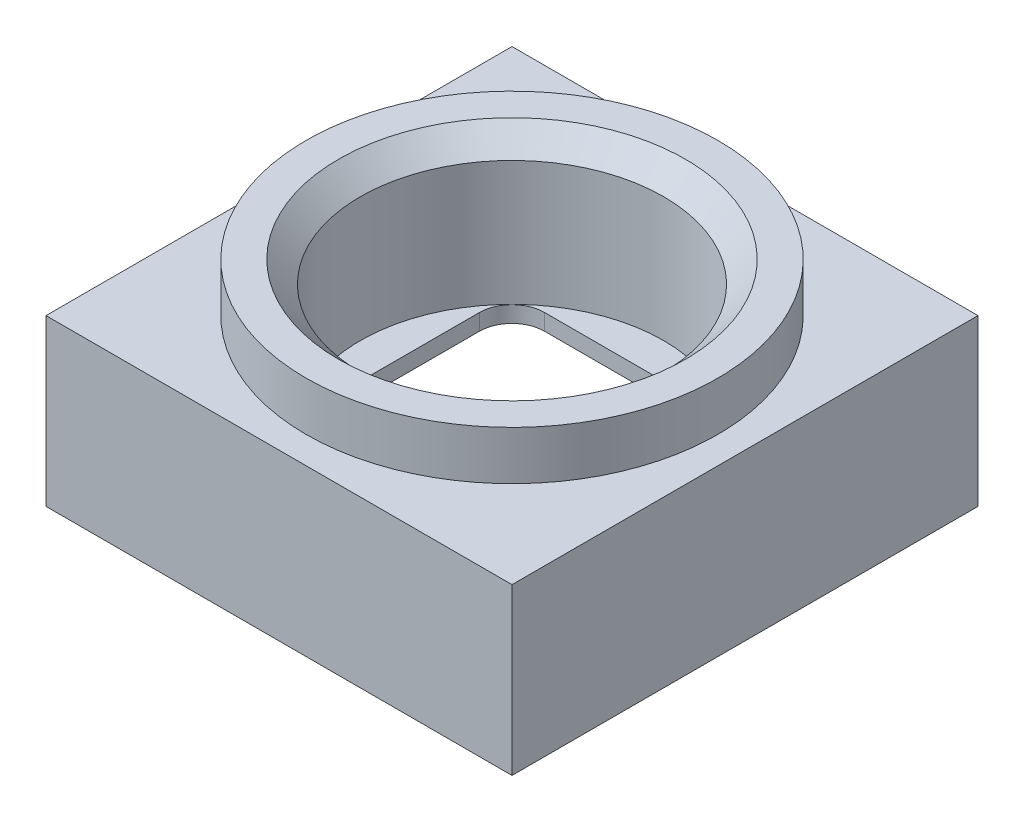
ISO-10303-21;
HEADER;
FILE_DESCRIPTION(('STEP AP214'),'2;1');
FILE_NAME('part.step','',(''),(''),'','','');
FILE_SCHEMA(('AUTOMOTIVE_DESIGN { 1 0 10303 214 1 1 1 1 }'));
ENDSEC;
DATA;
#1=APPLICATION_CONTEXT('core data for automotive mechanical design processes');
#2=APPLICATION_PROTOCOL_DEFINITION('international standard','automotive_design',2000,#1);
#3=PRODUCT_CONTEXT('',#1,'mechanical');
#4=PRODUCT('Part','Part','',(#3));
#5=PRODUCT_RELATED_PRODUCT_CATEGORY('part','',(#4));
#6=PRODUCT_DEFINITION_FORMATION('','',#4);
#7=PRODUCT_DEFINITION_CONTEXT('part definition',#1,'design');
#8=PRODUCT_DEFINITION('design','',#6,#7);
#9=PRODUCT_DEFINITION_SHAPE('','',#8);
#10=(LENGTH_UNIT() NAMED_UNIT(*) SI_UNIT(.MILLI.,.METRE.));
#11=(NAMED_UNIT(*) PLANE_ANGLE_UNIT() SI_UNIT($,.RADIAN.));
#12=(NAMED_UNIT(*) SI_UNIT($,.STERADIAN.) SOLID_ANGLE_UNIT());
#13=UNCERTAINTY_MEASURE_WITH_UNIT(LENGTH_MEASURE(1.E-05),#10,'distance_accuracy_value','');
#14=(GEOMETRIC_REPRESENTATION_CONTEXT(3) GLOBAL_UNCERTAINTY_ASSIGNED_CONTEXT((#13)) GLOBAL_UNIT_ASSIGNED_CONTEXT((#10,
#11,#12)) REPRESENTATION_CONTEXT('',''));
#15=CARTESIAN_POINT('',(0.,0.,0.));
#16=DIRECTION('',(0.,0.,1.));
#17=DIRECTION('',(1.,0.,0.));
#18=AXIS2_PLACEMENT_3D('',#15,#16,#17);
#19=CARTESIAN_POINT('',(0.,3.05,0.));
#20=DIRECTION('',(0.,1.,0.));
#21=DIRECTION('',(0.,0.,1.));
#22=AXIS2_PLACEMENT_3D('',#19,#20,#21);
#23=PLANE('',#22);
#24=DIRECTION('',(1.,0.,0.));
#25=VECTOR('',#24,1.);
#26=CARTESIAN_POINT('',(-4.3,3.05,4.3));
#27=LINE('',#26,#25);
#28=CARTESIAN_POINT('',(-4.3,3.05,4.3));
#29=VERTEX_POINT('',#28);
#30=CARTESIAN_POINT('',(4.3,3.05,4.3));
#31=VERTEX_POINT('',#30);
#32=EDGE_CURVE('E206',#29,#31,#27,.T.);
#33=ORIENTED_EDGE('',*,*,#32,.T.);
#34=DIRECTION('',(0.,0.,-1.));
#35=VECTOR('',#34,1.);
#36=CARTESIAN_POINT('',(4.3,3.05,4.3));
#37=LINE('',#36,#35);
#38=CARTESIAN_POINT('',(4.3,3.05,-4.3));
#39=VERTEX_POINT('',#38);
#40=EDGE_CURVE('E214',#31,#39,#37,.T.);
#41=ORIENTED_EDGE('',*,*,#40,.T.);
#42=DIRECTION('',(-1.,0.,0.));
#43=VECTOR('',#42,1.);
#44=CARTESIAN_POINT('',(4.3,3.05,-4.3));
#45=LINE('',#44,#43);
#46=CARTESIAN_POINT('',(-4.3,3.05,-4.3));
#47=VERTEX_POINT('',#46);
#48=EDGE_CURVE('E219',#39,#47,#45,.T.);
#49=ORIENTED_EDGE('',*,*,#48,.T.);
#50=DIRECTION('',(0.,0.,1.));
#51=VECTOR('',#50,1.);
#52=CARTESIAN_POINT('',(-4.3,3.05,-4.3));
#53=LINE('',#52,#51);
#54=EDGE_CURVE('E224',#47,#29,#53,.T.);
#55=ORIENTED_EDGE('',*,*,#54,.T.);
#56=EDGE_LOOP('',(#33,#41,#49,#55));
#57=FACE_BOUND('',#56,.T.);
#58=CARTESIAN_POINT('',(0.,3.05,0.));
#59=DIRECTION('',(0.,1.,0.));
#60=DIRECTION('',(0.,0.,1.));
#61=AXIS2_PLACEMENT_3D('',#58,#59,#60);
#62=CIRCLE('',#61,3.8);
#63=CARTESIAN_POINT('',(0.,3.05,3.8));
#64=VERTEX_POINT('',#63);
#65=EDGE_CURVE('E228',#64,#64,#62,.T.);
#66=ORIENTED_EDGE('',*,*,#65,.F.);
#67=EDGE_LOOP('',(#66));
#68=FACE_BOUND('',#67,.T.);
#69=ADVANCED_FACE('F37',(#57,#68),#23,.T.);
#70=CARTESIAN_POINT('',(0.,1.25,0.));
#71=DIRECTION('',(0.,1.,0.));
#72=DIRECTION('',(0.,0.,1.));
#73=AXIS2_PLACEMENT_3D('',#70,#71,#72);
#74=PLANE('',#73);
#75=DIRECTION('',(1.,0.,0.));
#76=VECTOR('',#75,1.);
#77=CARTESIAN_POINT('',(-1.55,1.25,2.15));
#78=LINE('',#77,#76);
#79=CARTESIAN_POINT('',(-1.55,1.25,2.15));
#80=VERTEX_POINT('',#79);
#81=CARTESIAN_POINT('',(1.55,1.25,2.15));
#82=VERTEX_POINT('',#81);
#83=EDGE_CURVE('E237',#80,#82,#78,.T.);
#84=ORIENTED_EDGE('',*,*,#83,.F.);
#85=CARTESIAN_POINT('',(-1.55,1.25,1.55));
#86=DIRECTION('',(0.,1.,0.));
#87=DIRECTION('',(0.,0.,1.));
#88=AXIS2_PLACEMENT_3D('',#85,#86,#87);
#89=CIRCLE('',#88,0.6);
#90=CARTESIAN_POINT('',(-2.15,1.25,1.55));
#91=VERTEX_POINT('',#90);
#92=EDGE_CURVE('E235',#91,#80,#89,.T.);
#93=ORIENTED_EDGE('',*,*,#92,.F.);
#94=DIRECTION('',(0.,0.,1.));
#95=VECTOR('',#94,1.);
#96=CARTESIAN_POINT('',(-2.15,1.25,-1.55));
#97=LINE('',#96,#95);
#98=CARTESIAN_POINT('',(-2.15,1.25,-1.55));
#99=VERTEX_POINT('',#98);
#100=EDGE_CURVE('E251',#99,#91,#97,.T.);
#101=ORIENTED_EDGE('',*,*,#100,.F.);
#102=CARTESIAN_POINT('',(-1.55,1.25,-1.55));
#103=DIRECTION('',(0.,1.,0.));
#104=DIRECTION('',(0.,0.,1.));
#105=AXIS2_PLACEMENT_3D('',#102,#103,#104);
#106=CIRCLE('',#105,0.6);
#107=CARTESIAN_POINT('',(-1.55,1.25,-2.15));
#108=VERTEX_POINT('',#107);
#109=EDGE_CURVE('E248',#108,#99,#106,.T.);
#110=ORIENTED_EDGE('',*,*,#109,.F.);
#111=DIRECTION('',(-1.,0.,0.));
#112=VECTOR('',#111,1.);
#113=CARTESIAN_POINT('',(-1.55,1.25,-2.15));
#114=LINE('',#113,#112);
#115=CARTESIAN_POINT('',(1.55,1.25,-2.15));
#116=VERTEX_POINT('',#115);
#117=EDGE_CURVE('E246',#116,#108,#114,.T.);
#118=ORIENTED_EDGE('',*,*,#117,.F.);
#119=CARTESIAN_POINT('',(1.55,1.25,-1.55));
#120=DIRECTION('',(0.,1.,0.));
#121=DIRECTION('',(0.,0.,-1.));
#122=AXIS2_PLACEMENT_3D('',#119,#120,#121);
#123=CIRCLE('',#122,0.6);
#124=CARTESIAN_POINT('',(2.15,1.25,-1.55));
#125=VERTEX_POINT('',#124);
#126=EDGE_CURVE('E244',#125,#116,#123,.T.);
#127=ORIENTED_EDGE('',*,*,#126,.F.);
#128=DIRECTION('',(0.,0.,-1.));
#129=VECTOR('',#128,1.);
#130=CARTESIAN_POINT('',(2.15,1.25,-1.55));
#131=LINE('',#130,#129);
#132=CARTESIAN_POINT('',(2.15,1.25,1.55));
#133=VERTEX_POINT('',#132);
#134=EDGE_CURVE('E242',#133,#125,#131,.T.);
#135=ORIENTED_EDGE('',*,*,#134,.F.);
#136=CARTESIAN_POINT('',(1.55,1.25,1.55));
#137=DIRECTION('',(0.,1.,0.));
#138=DIRECTION('',(0.,0.,1.));
#139=AXIS2_PLACEMENT_3D('',#136,#137,#138);
#140=CIRCLE('',#139,0.600000000000001);
#141=EDGE_CURVE('E240',#82,#133,#140,.T.);
#142=ORIENTED_EDGE('',*,*,#141,.F.);
#143=EDGE_LOOP('',(#84,#93,#101,#110,#118,#127,#135,#142));
#144=FACE_BOUND('',#143,.T.);
#145=CARTESIAN_POINT('',(0.,1.25,0.));
#146=DIRECTION('',(0.,1.,0.));
#147=DIRECTION('',(0.,0.,1.));
#148=AXIS2_PLACEMENT_3D('',#145,#146,#147);
#149=CIRCLE('',#148,2.8);
#150=CARTESIAN_POINT('',(0.,1.25,2.8));
#151=VERTEX_POINT('',#150);
#152=EDGE_CURVE('E400',#151,#151,#149,.F.);
#153=ORIENTED_EDGE('',*,*,#152,.F.);
#154=EDGE_LOOP('',(#153));
#155=FACE_BOUND('',#154,.T.);
#156=ADVANCED_FACE('F419',(#144,#155),#74,.T.);
#157=CARTESIAN_POINT('',(0.,0.,0.));
#158=DIRECTION('',(0.,1.,0.));
#159=DIRECTION('',(0.,0.,1.));
#160=AXIS2_PLACEMENT_3D('',#157,#158,#159);
#161=PLANE('',#160);
#162=DIRECTION('',(0.,0.,1.));
#163=VECTOR('',#162,1.);
#164=CARTESIAN_POINT('',(-4.3,0.,-4.3));
#165=LINE('',#164,#163);
#166=CARTESIAN_POINT('',(-4.3,0.,-4.3));
#167=VERTEX_POINT('',#166);
#168=CARTESIAN_POINT('',(-4.3,0.,4.3));
#169=VERTEX_POINT('',#168);
#170=EDGE_CURVE('E389',#167,#169,#165,.T.);
#171=ORIENTED_EDGE('',*,*,#170,.F.);
#172=DIRECTION('',(-1.,0.,0.));
#173=VECTOR('',#172,1.);
#174=CARTESIAN_POINT('',(-4.3,0.,-4.3));
#175=LINE('',#174,#173);
#176=CARTESIAN_POINT('',(4.3,0.,-4.3));
#177=VERTEX_POINT('',#176);
#178=EDGE_CURVE('E60',#177,#167,#175,.T.);
#179=ORIENTED_EDGE('',*,*,#178,.F.);
#180=DIRECTION('',(0.,0.,-1.));
#181=VECTOR('',#180,1.);
#182=CARTESIAN_POINT('',(4.3,0.,-4.3));
#183=LINE('',#182,#181);
#184=CARTESIAN_POINT('',(4.3,0.,4.3));
#185=VERTEX_POINT('',#184);
#186=EDGE_CURVE('E393',#185,#177,#183,.T.);
#187=ORIENTED_EDGE('',*,*,#186,.F.);
#188=DIRECTION('',(1.,0.,0.));
#189=VECTOR('',#188,1.);
#190=CARTESIAN_POINT('',(-4.3,0.,4.3));
#191=LINE('',#190,#189);
#192=EDGE_CURVE('E207',#169,#185,#191,.T.);
#193=ORIENTED_EDGE('',*,*,#192,.F.);
#194=EDGE_LOOP('',(#171,#179,#187,#193));
#195=FACE_BOUND('',#194,.T.);
#196=DIRECTION('',(0.,0.,1.));
#197=VECTOR('',#196,1.);
#198=CARTESIAN_POINT('',(-4.,0.,-4.));
#199=LINE('',#198,#197);
#200=CARTESIAN_POINT('',(-4.,0.,-4.));
#201=VERTEX_POINT('',#200);
#202=CARTESIAN_POINT('',(-4.,0.,4.));
#203=VERTEX_POINT('',#202);
#204=EDGE_CURVE('E52',#201,#203,#199,.T.);
#205=ORIENTED_EDGE('',*,*,#204,.T.);
#206=DIRECTION('',(1.,0.,0.));
#207=VECTOR('',#206,1.);
#208=CARTESIAN_POINT('',(-4.,0.,4.));
#209=LINE('',#208,#207);
#210=CARTESIAN_POINT('',(4.,0.,4.));
#211=VERTEX_POINT('',#210);
#212=EDGE_CURVE('E374',#203,#211,#209,.T.);
#213=ORIENTED_EDGE('',*,*,#212,.T.);
#214=DIRECTION('',(0.,0.,-1.));
#215=VECTOR('',#214,1.);
#216=CARTESIAN_POINT('',(4.,0.,-4.));
#217=LINE('',#216,#215);
#218=CARTESIAN_POINT('',(4.,0.,-4.));
#219=VERTEX_POINT('',#218);
#220=EDGE_CURVE('E377',#211,#219,#217,.T.);
#221=ORIENTED_EDGE('',*,*,#220,.T.);
#222=DIRECTION('',(-1.,0.,0.));
#223=VECTOR('',#222,1.);
#224=CARTESIAN_POINT('',(-4.,0.,-4.));
#225=LINE('',#224,#223);
#226=EDGE_CURVE('E363',#219,#201,#225,.T.);
#227=ORIENTED_EDGE('',*,*,#226,.T.);
#228=EDGE_LOOP('',(#205,#213,#221,#227));
#229=FACE_BOUND('',#228,.T.);
#230=ADVANCED_FACE('F424',(#195,#229),#161,.F.);
#231=CARTESIAN_POINT('',(-4.3,0.6,-4.3));
#232=DIRECTION('',(1.,0.,0.));
#233=DIRECTION('',(0.,0.,-1.));
#234=AXIS2_PLACEMENT_3D('',#231,#232,#233);
#235=PLANE('',#234);
#236=ORIENTED_EDGE('',*,*,#170,.T.);
#237=DIRECTION('',(0.,-1.,0.));
#238=VECTOR('',#237,1.);
#239=CARTESIAN_POINT('',(-4.3,0.6,4.3));
#240=LINE('',#239,#238);
#241=EDGE_CURVE('E210',#29,#169,#240,.T.);
#242=ORIENTED_EDGE('',*,*,#241,.F.);
#243=ORIENTED_EDGE('',*,*,#54,.F.);
#244=DIRECTION('',(0.,-1.,0.));
#245=VECTOR('',#244,1.);
#246=CARTESIAN_POINT('',(-4.3,0.6,-4.3));
#247=LINE('',#246,#245);
#248=EDGE_CURVE('E396',#47,#167,#247,.T.);
#249=ORIENTED_EDGE('',*,*,#248,.T.);
#250=EDGE_LOOP('',(#236,#242,#243,#249));
#251=FACE_BOUND('',#250,.T.);
#252=ADVANCED_FACE('F519',(#251),#235,.F.);
#253=CARTESIAN_POINT('',(-4.3,0.6,4.3));
#254=DIRECTION('',(0.,0.,-1.));
#255=DIRECTION('',(-1.,0.,0.));
#256=AXIS2_PLACEMENT_3D('',#253,#254,#255);
#257=PLANE('',#256);
#258=ORIENTED_EDGE('',*,*,#192,.T.);
#259=DIRECTION('',(0.,-1.,0.));
#260=VECTOR('',#259,1.);
#261=CARTESIAN_POINT('',(4.3,0.6,4.3));
#262=LINE('',#261,#260);
#263=EDGE_CURVE('E201',#31,#185,#262,.T.);
#264=ORIENTED_EDGE('',*,*,#263,.F.);
#265=ORIENTED_EDGE('',*,*,#32,.F.);
#266=ORIENTED_EDGE('',*,*,#241,.T.);
#267=EDGE_LOOP('',(#258,#264,#265,#266));
#268=FACE_BOUND('',#267,.T.);
#269=ADVANCED_FACE('F203',(#268),#257,.F.);
#270=CARTESIAN_POINT('',(4.3,0.6,-4.3));
#271=DIRECTION('',(-1.,0.,0.));
#272=DIRECTION('',(0.,0.,1.));
#273=AXIS2_PLACEMENT_3D('',#270,#271,#272);
#274=PLANE('',#273);
#275=ORIENTED_EDGE('',*,*,#186,.T.);
#276=DIRECTION('',(0.,-1.,0.));
#277=VECTOR('',#276,1.);
#278=CARTESIAN_POINT('',(4.3,0.6,-4.3));
#279=LINE('',#278,#277);
#280=EDGE_CURVE('E211',#39,#177,#279,.T.);
#281=ORIENTED_EDGE('',*,*,#280,.F.);
#282=ORIENTED_EDGE('',*,*,#40,.F.);
#283=ORIENTED_EDGE('',*,*,#263,.T.);
#284=EDGE_LOOP('',(#275,#281,#282,#283));
#285=FACE_BOUND('',#284,.T.);
#286=ADVANCED_FACE('F215',(#285),#274,.F.);
#287=CARTESIAN_POINT('',(-4.3,0.6,-4.3));
#288=DIRECTION('',(0.,0.,1.));
#289=DIRECTION('',(1.,0.,0.));
#290=AXIS2_PLACEMENT_3D('',#287,#288,#289);
#291=PLANE('',#290);
#292=ORIENTED_EDGE('',*,*,#178,.T.);
#293=ORIENTED_EDGE('',*,*,#248,.F.);
#294=ORIENTED_EDGE('',*,*,#48,.F.);
#295=ORIENTED_EDGE('',*,*,#280,.T.);
#296=EDGE_LOOP('',(#292,#293,#294,#295));
#297=FACE_BOUND('',#296,.T.);
#298=ADVANCED_FACE('F516',(#297),#291,.F.);
#299=CARTESIAN_POINT('',(-4.,0.6,-4.));
#300=DIRECTION('',(1.,0.,0.));
#301=DIRECTION('',(0.,0.,-1.));
#302=AXIS2_PLACEMENT_3D('',#299,#300,#301);
#303=PLANE('',#302);
#304=ORIENTED_EDGE('',*,*,#204,.F.);
#305=DIRECTION('',(0.,-1.,0.));
#306=VECTOR('',#305,1.);
#307=CARTESIAN_POINT('',(-4.,0.6,-4.));
#308=LINE('',#307,#306);
#309=CARTESIAN_POINT('',(-4.,0.6,-4.));
#310=VERTEX_POINT('',#309);
#311=EDGE_CURVE('E372',#310,#201,#308,.T.);
#312=ORIENTED_EDGE('',*,*,#311,.F.);
#313=DIRECTION('',(0.,0.,1.));
#314=VECTOR('',#313,1.);
#315=CARTESIAN_POINT('',(-4.,0.6,-4.));
#316=LINE('',#315,#314);
#317=CARTESIAN_POINT('',(-4.,0.6,4.));
#318=VERTEX_POINT('',#317);
#319=EDGE_CURVE('E359',#310,#318,#316,.T.);
#320=ORIENTED_EDGE('',*,*,#319,.T.);
#321=DIRECTION('',(0.,-1.,0.));
#322=VECTOR('',#321,1.);
#323=CARTESIAN_POINT('',(-4.,0.6,4.));
#324=LINE('',#323,#322);
#325=EDGE_CURVE('E387',#318,#203,#324,.T.);
#326=ORIENTED_EDGE('',*,*,#325,.T.);
#327=EDGE_LOOP('',(#304,#312,#320,#326));
#328=FACE_BOUND('',#327,.T.);
#329=ADVANCED_FACE('F512',(#328),#303,.T.);
#330=CARTESIAN_POINT('',(-4.,0.6,4.));
#331=DIRECTION('',(0.,0.,-1.));
#332=DIRECTION('',(-1.,0.,0.));
#333=AXIS2_PLACEMENT_3D('',#330,#331,#332);
#334=PLANE('',#333);
#335=ORIENTED_EDGE('',*,*,#212,.F.);
#336=ORIENTED_EDGE('',*,*,#325,.F.);
#337=DIRECTION('',(1.,0.,0.));
#338=VECTOR('',#337,1.);
#339=CARTESIAN_POINT('',(-4.,0.6,4.));
#340=LINE('',#339,#338);
#341=CARTESIAN_POINT('',(4.,0.6,4.));
#342=VERTEX_POINT('',#341);
#343=EDGE_CURVE('E362',#318,#342,#340,.T.);
#344=ORIENTED_EDGE('',*,*,#343,.T.);
#345=DIRECTION('',(0.,-1.,0.));
#346=VECTOR('',#345,1.);
#347=CARTESIAN_POINT('',(4.,0.6,4.));
#348=LINE('',#347,#346);
#349=EDGE_CURVE('E385',#342,#211,#348,.T.);
#350=ORIENTED_EDGE('',*,*,#349,.T.);
#351=EDGE_LOOP('',(#335,#336,#344,#350));
#352=FACE_BOUND('',#351,.T.);
#353=ADVANCED_FACE('F508',(#352),#334,.T.);
#354=CARTESIAN_POINT('',(4.,0.6,-4.));
#355=DIRECTION('',(-1.,0.,0.));
#356=DIRECTION('',(0.,0.,1.));
#357=AXIS2_PLACEMENT_3D('',#354,#355,#356);
#358=PLANE('',#357);
#359=ORIENTED_EDGE('',*,*,#220,.F.);
#360=ORIENTED_EDGE('',*,*,#349,.F.);
#361=DIRECTION('',(0.,0.,-1.));
#362=VECTOR('',#361,1.);
#363=CARTESIAN_POINT('',(4.,0.6,-4.));
#364=LINE('',#363,#362);
#365=CARTESIAN_POINT('',(4.,0.6,-4.));
#366=VERTEX_POINT('',#365);
#367=EDGE_CURVE('E366',#342,#366,#364,.T.);
#368=ORIENTED_EDGE('',*,*,#367,.T.);
#369=DIRECTION('',(0.,-1.,0.));
#370=VECTOR('',#369,1.);
#371=CARTESIAN_POINT('',(4.,0.6,-4.));
#372=LINE('',#371,#370);
#373=EDGE_CURVE('E383',#366,#219,#372,.T.);
#374=ORIENTED_EDGE('',*,*,#373,.T.);
#375=EDGE_LOOP('',(#359,#360,#368,#374));
#376=FACE_BOUND('',#375,.T.);
#377=ADVANCED_FACE('F504',(#376),#358,.T.);
#378=CARTESIAN_POINT('',(-4.,0.6,-4.));
#379=DIRECTION('',(0.,0.,1.));
#380=DIRECTION('',(1.,0.,0.));
#381=AXIS2_PLACEMENT_3D('',#378,#379,#380);
#382=PLANE('',#381);
#383=ORIENTED_EDGE('',*,*,#226,.F.);
#384=ORIENTED_EDGE('',*,*,#373,.F.);
#385=DIRECTION('',(-1.,0.,0.));
#386=VECTOR('',#385,1.);
#387=CARTESIAN_POINT('',(-4.,0.6,-4.));
#388=LINE('',#387,#386);
#389=EDGE_CURVE('E369',#366,#310,#388,.T.);
#390=ORIENTED_EDGE('',*,*,#389,.T.);
#391=ORIENTED_EDGE('',*,*,#311,.T.);
#392=EDGE_LOOP('',(#383,#384,#390,#391));
#393=FACE_BOUND('',#392,.T.);
#394=ADVANCED_FACE('F500',(#393),#382,.T.);
#395=CARTESIAN_POINT('',(0.,0.6,0.));
#396=DIRECTION('',(0.,1.,0.));
#397=DIRECTION('',(0.,0.,1.));
#398=AXIS2_PLACEMENT_3D('',#395,#396,#397);
#399=PLANE('',#398);
#400=ORIENTED_EDGE('',*,*,#319,.F.);
#401=ORIENTED_EDGE('',*,*,#389,.F.);
#402=ORIENTED_EDGE('',*,*,#367,.F.);
#403=ORIENTED_EDGE('',*,*,#343,.F.);
#404=EDGE_LOOP('',(#400,#401,#402,#403));
#405=FACE_BOUND('',#404,.T.);
#406=CARTESIAN_POINT('',(3.1,0.6,-3.1));
#407=DIRECTION('',(0.,1.,0.));
#408=DIRECTION('',(0.,0.,1.));
#409=AXIS2_PLACEMENT_3D('',#406,#407,#408);
#410=CIRCLE('',#409,0.35);
#411=CARTESIAN_POINT('',(3.2,0.6,-2.76458980337503));
#412=VERTEX_POINT('',#411);
#413=CARTESIAN_POINT('',(2.76458980337503,0.6,-3.2));
#414=VERTEX_POINT('',#413);
#415=EDGE_CURVE('E293',#412,#414,#410,.T.);
#416=ORIENTED_EDGE('',*,*,#415,.T.);
#417=DIRECTION('',(-1.,0.,0.));
#418=VECTOR('',#417,1.);
#419=CARTESIAN_POINT('',(-2.76458980337503,0.6,-3.2));
#420=LINE('',#419,#418);
#421=CARTESIAN_POINT('',(-2.76458980337503,0.6,-3.2));
#422=VERTEX_POINT('',#421);
#423=EDGE_CURVE('E322',#414,#422,#420,.T.);
#424=ORIENTED_EDGE('',*,*,#423,.T.);
#425=CARTESIAN_POINT('',(-3.1,0.6,-3.1));
#426=DIRECTION('',(0.,1.,0.));
#427=DIRECTION('',(0.,0.,-1.));
#428=AXIS2_PLACEMENT_3D('',#425,#426,#427);
#429=CIRCLE('',#428,0.35);
#430=CARTESIAN_POINT('',(-3.2,0.6,-2.76458980337503));
#431=VERTEX_POINT('',#430);
#432=EDGE_CURVE('E325',#422,#431,#429,.T.);
#433=ORIENTED_EDGE('',*,*,#432,.T.);
#434=DIRECTION('',(0.,0.,1.));
#435=VECTOR('',#434,1.);
#436=CARTESIAN_POINT('',(-3.2,0.6,-2.76458980337503));
#437=LINE('',#436,#435);
#438=CARTESIAN_POINT('',(-3.2,0.6,2.76458980337503));
#439=VERTEX_POINT('',#438);
#440=EDGE_CURVE('E328',#431,#439,#437,.T.);
#441=ORIENTED_EDGE('',*,*,#440,.T.);
#442=CARTESIAN_POINT('',(-3.1,0.6,3.1));
#443=DIRECTION('',(0.,1.,0.));
#444=DIRECTION('',(0.,0.,1.));
#445=AXIS2_PLACEMENT_3D('',#442,#443,#444);
#446=CIRCLE('',#445,0.35);
#447=CARTESIAN_POINT('',(-2.76458980337503,0.6,3.2));
#448=VERTEX_POINT('',#447);
#449=EDGE_CURVE('E331',#439,#448,#446,.T.);
#450=ORIENTED_EDGE('',*,*,#449,.T.);
#451=DIRECTION('',(1.,0.,0.));
#452=VECTOR('',#451,1.);
#453=CARTESIAN_POINT('',(-2.76458980337503,0.6,3.2));
#454=LINE('',#453,#452);
#455=CARTESIAN_POINT('',(2.76458980337503,0.6,3.2));
#456=VERTEX_POINT('',#455);
#457=EDGE_CURVE('E334',#448,#456,#454,.T.);
#458=ORIENTED_EDGE('',*,*,#457,.T.);
#459=CARTESIAN_POINT('',(3.1,0.6,3.1));
#460=DIRECTION('',(0.,1.,0.));
#461=DIRECTION('',(0.,0.,-1.));
#462=AXIS2_PLACEMENT_3D('',#459,#460,#461);
#463=CIRCLE('',#462,0.35);
#464=CARTESIAN_POINT('',(3.2,0.6,2.76458980337503));
#465=VERTEX_POINT('',#464);
#466=EDGE_CURVE('E337',#456,#465,#463,.T.);
#467=ORIENTED_EDGE('',*,*,#466,.T.);
#468=DIRECTION('',(0.,0.,-1.));
#469=VECTOR('',#468,1.);
#470=CARTESIAN_POINT('',(3.2,0.6,-2.76458980337503));
#471=LINE('',#470,#469);
#472=EDGE_CURVE('E298',#465,#412,#471,.T.);
#473=ORIENTED_EDGE('',*,*,#472,.T.);
#474=EDGE_LOOP('',(#416,#424,#433,#441,#450,#458,#467,#473));
#475=FACE_BOUND('',#474,.T.);
#476=ADVANCED_FACE('F496',(#405,#475),#399,.F.);
#477=CARTESIAN_POINT('',(3.1,0.95,-3.1));
#478=DIRECTION('',(0.,-1.,0.));
#479=DIRECTION('',(0.,0.,-1.));
#480=AXIS2_PLACEMENT_3D('',#477,#478,#479);
#481=CYLINDRICAL_SURFACE('',#480,0.35);
#482=ORIENTED_EDGE('',*,*,#415,.F.);
#483=DIRECTION('',(0.,-1.,0.));
#484=VECTOR('',#483,1.);
#485=CARTESIAN_POINT('',(3.2,0.95,-2.76458980337503));
#486=LINE('',#485,#484);
#487=CARTESIAN_POINT('',(3.2,0.95,-2.76458980337503));
#488=VERTEX_POINT('',#487);
#489=EDGE_CURVE('E319',#488,#412,#486,.T.);
#490=ORIENTED_EDGE('',*,*,#489,.F.);
#491=CARTESIAN_POINT('',(3.1,0.95,-3.1));
#492=DIRECTION('',(0.,1.,0.));
#493=DIRECTION('',(0.,0.,1.));
#494=AXIS2_PLACEMENT_3D('',#491,#492,#493);
#495=CIRCLE('',#494,0.35);
#496=CARTESIAN_POINT('',(2.76458980337503,0.95,-3.2));
#497=VERTEX_POINT('',#496);
#498=EDGE_CURVE('E294',#488,#497,#495,.T.);
#499=ORIENTED_EDGE('',*,*,#498,.T.);
#500=DIRECTION('',(0.,-1.,0.));
#501=VECTOR('',#500,1.);
#502=CARTESIAN_POINT('',(2.76458980337503,0.95,-3.2));
#503=LINE('',#502,#501);
#504=EDGE_CURVE('E356',#497,#414,#503,.T.);
#505=ORIENTED_EDGE('',*,*,#504,.T.);
#506=EDGE_LOOP('',(#482,#490,#499,#505));
#507=FACE_BOUND('',#506,.T.);
#508=ADVANCED_FACE('F492',(#507),#481,.F.);
#509=CARTESIAN_POINT('',(-2.76458980337503,0.95,-3.2));
#510=DIRECTION('',(0.,0.,1.));
#511=DIRECTION('',(1.,0.,0.));
#512=AXIS2_PLACEMENT_3D('',#509,#510,#511);
#513=PLANE('',#512);
#514=ORIENTED_EDGE('',*,*,#423,.F.);
#515=ORIENTED_EDGE('',*,*,#504,.F.);
#516=DIRECTION('',(-1.,0.,0.));
#517=VECTOR('',#516,1.);
#518=CARTESIAN_POINT('',(-2.76458980337503,0.95,-3.2));
#519=LINE('',#518,#517);
#520=CARTESIAN_POINT('',(-2.76458980337503,0.95,-3.2));
#521=VERTEX_POINT('',#520);
#522=EDGE_CURVE('E297',#497,#521,#519,.T.);
#523=ORIENTED_EDGE('',*,*,#522,.T.);
#524=DIRECTION('',(0.,-1.,0.));
#525=VECTOR('',#524,1.);
#526=CARTESIAN_POINT('',(-2.76458980337503,0.95,-3.2));
#527=LINE('',#526,#525);
#528=EDGE_CURVE('E354',#521,#422,#527,.T.);
#529=ORIENTED_EDGE('',*,*,#528,.T.);
#530=EDGE_LOOP('',(#514,#515,#523,#529));
#531=FACE_BOUND('',#530,.T.);
#532=ADVANCED_FACE('F488',(#531),#513,.T.);
#533=CARTESIAN_POINT('',(-3.1,0.95,-3.1));
#534=DIRECTION('',(0.,-1.,0.));
#535=DIRECTION('',(0.,0.,-1.));
#536=AXIS2_PLACEMENT_3D('',#533,#534,#535);
#537=CYLINDRICAL_SURFACE('',#536,0.35);
#538=ORIENTED_EDGE('',*,*,#432,.F.);
#539=ORIENTED_EDGE('',*,*,#528,.F.);
#540=CARTESIAN_POINT('',(-3.1,0.95,-3.1));
#541=DIRECTION('',(0.,1.,0.));
#542=DIRECTION('',(0.,0.,-1.));
#543=AXIS2_PLACEMENT_3D('',#540,#541,#542);
#544=CIRCLE('',#543,0.35);
#545=CARTESIAN_POINT('',(-3.2,0.95,-2.76458980337503));
#546=VERTEX_POINT('',#545);
#547=EDGE_CURVE('E301',#521,#546,#544,.T.);
#548=ORIENTED_EDGE('',*,*,#547,.T.);
#549=DIRECTION('',(0.,-1.,0.));
#550=VECTOR('',#549,1.);
#551=CARTESIAN_POINT('',(-3.2,0.95,-2.76458980337503));
#552=LINE('',#551,#550);
#553=EDGE_CURVE('E352',#546,#431,#552,.T.);
#554=ORIENTED_EDGE('',*,*,#553,.T.);
#555=EDGE_LOOP('',(#538,#539,#548,#554));
#556=FACE_BOUND('',#555,.T.);
#557=ADVANCED_FACE('F484',(#556),#537,.F.);
#558=CARTESIAN_POINT('',(-3.2,0.95,-2.76458980337503));
#559=DIRECTION('',(1.,0.,0.));
#560=DIRECTION('',(0.,0.,-1.));
#561=AXIS2_PLACEMENT_3D('',#558,#559,#560);
#562=PLANE('',#561);
#563=ORIENTED_EDGE('',*,*,#440,.F.);
#564=ORIENTED_EDGE('',*,*,#553,.F.);
#565=DIRECTION('',(0.,0.,1.));
#566=VECTOR('',#565,1.);
#567=CARTESIAN_POINT('',(-3.2,0.95,-2.76458980337503));
#568=LINE('',#567,#566);
#569=CARTESIAN_POINT('',(-3.2,0.95,2.76458980337503));
#570=VERTEX_POINT('',#569);
#571=EDGE_CURVE('E304',#546,#570,#568,.T.);
#572=ORIENTED_EDGE('',*,*,#571,.T.);
#573=DIRECTION('',(0.,-1.,0.));
#574=VECTOR('',#573,1.);
#575=CARTESIAN_POINT('',(-3.2,0.95,2.76458980337503));
#576=LINE('',#575,#574);
#577=EDGE_CURVE('E350',#570,#439,#576,.T.);
#578=ORIENTED_EDGE('',*,*,#577,.T.);
#579=EDGE_LOOP('',(#563,#564,#572,#578));
#580=FACE_BOUND('',#579,.T.);
#581=ADVANCED_FACE('F480',(#580),#562,.T.);
#582=CARTESIAN_POINT('',(-3.1,0.95,3.1));
#583=DIRECTION('',(0.,-1.,0.));
#584=DIRECTION('',(0.,0.,-1.));
#585=AXIS2_PLACEMENT_3D('',#582,#583,#584);
#586=CYLINDRICAL_SURFACE('',#585,0.35);
#587=ORIENTED_EDGE('',*,*,#449,.F.);
#588=ORIENTED_EDGE('',*,*,#577,.F.);
#589=CARTESIAN_POINT('',(-3.1,0.95,3.1));
#590=DIRECTION('',(0.,1.,0.));
#591=DIRECTION('',(0.,0.,1.));
#592=AXIS2_PLACEMENT_3D('',#589,#590,#591);
#593=CIRCLE('',#592,0.35);
#594=CARTESIAN_POINT('',(-2.76458980337503,0.95,3.2));
#595=VERTEX_POINT('',#594);
#596=EDGE_CURVE('E307',#570,#595,#593,.T.);
#597=ORIENTED_EDGE('',*,*,#596,.T.);
#598=DIRECTION('',(0.,-1.,0.));
#599=VECTOR('',#598,1.);
#600=CARTESIAN_POINT('',(-2.76458980337503,0.95,3.2));
#601=LINE('',#600,#599);
#602=EDGE_CURVE('E348',#595,#448,#601,.T.);
#603=ORIENTED_EDGE('',*,*,#602,.T.);
#604=EDGE_LOOP('',(#587,#588,#597,#603));
#605=FACE_BOUND('',#604,.T.);
#606=ADVANCED_FACE('F476',(#605),#586,.F.);
#607=CARTESIAN_POINT('',(-2.76458980337503,0.95,3.2));
#608=DIRECTION('',(0.,0.,-1.));
#609=DIRECTION('',(-1.,0.,0.));
#610=AXIS2_PLACEMENT_3D('',#607,#608,#609);
#611=PLANE('',#610);
#612=ORIENTED_EDGE('',*,*,#457,.F.);
#613=ORIENTED_EDGE('',*,*,#602,.F.);
#614=DIRECTION('',(1.,0.,0.));
#615=VECTOR('',#614,1.);
#616=CARTESIAN_POINT('',(-2.76458980337503,0.95,3.2));
#617=LINE('',#616,#615);
#618=CARTESIAN_POINT('',(2.76458980337503,0.95,3.2));
#619=VERTEX_POINT('',#618);
#620=EDGE_CURVE('E310',#595,#619,#617,.T.);
#621=ORIENTED_EDGE('',*,*,#620,.T.);
#622=DIRECTION('',(0.,-1.,0.));
#623=VECTOR('',#622,1.);
#624=CARTESIAN_POINT('',(2.76458980337503,0.95,3.2));
#625=LINE('',#624,#623);
#626=EDGE_CURVE('E346',#619,#456,#625,.T.);
#627=ORIENTED_EDGE('',*,*,#626,.T.);
#628=EDGE_LOOP('',(#612,#613,#621,#627));
#629=FACE_BOUND('',#628,.T.);
#630=ADVANCED_FACE('F472',(#629),#611,.T.);
#631=CARTESIAN_POINT('',(3.1,0.95,3.1));
#632=DIRECTION('',(0.,-1.,0.));
#633=DIRECTION('',(0.,0.,-1.));
#634=AXIS2_PLACEMENT_3D('',#631,#632,#633);
#635=CYLINDRICAL_SURFACE('',#634,0.35);
#636=ORIENTED_EDGE('',*,*,#466,.F.);
#637=ORIENTED_EDGE('',*,*,#626,.F.);
#638=CARTESIAN_POINT('',(3.1,0.95,3.1));
#639=DIRECTION('',(0.,1.,0.));
#640=DIRECTION('',(0.,0.,-1.));
#641=AXIS2_PLACEMENT_3D('',#638,#639,#640);
#642=CIRCLE('',#641,0.35);
#643=CARTESIAN_POINT('',(3.2,0.95,2.76458980337503));
#644=VERTEX_POINT('',#643);
#645=EDGE_CURVE('E313',#619,#644,#642,.T.);
#646=ORIENTED_EDGE('',*,*,#645,.T.);
#647=DIRECTION('',(0.,-1.,0.));
#648=VECTOR('',#647,1.);
#649=CARTESIAN_POINT('',(3.2,0.95,2.76458980337503));
#650=LINE('',#649,#648);
#651=EDGE_CURVE('E344',#644,#465,#650,.T.);
#652=ORIENTED_EDGE('',*,*,#651,.T.);
#653=EDGE_LOOP('',(#636,#637,#646,#652));
#654=FACE_BOUND('',#653,.T.);
#655=ADVANCED_FACE('F468',(#654),#635,.F.);
#656=CARTESIAN_POINT('',(3.2,0.95,-2.76458980337503));
#657=DIRECTION('',(-1.,0.,0.));
#658=DIRECTION('',(0.,0.,1.));
#659=AXIS2_PLACEMENT_3D('',#656,#657,#658);
#660=PLANE('',#659);
#661=ORIENTED_EDGE('',*,*,#472,.F.);
#662=ORIENTED_EDGE('',*,*,#651,.F.);
#663=DIRECTION('',(0.,0.,-1.));
#664=VECTOR('',#663,1.);
#665=CARTESIAN_POINT('',(3.2,0.95,-2.76458980337503));
#666=LINE('',#665,#664);
#667=EDGE_CURVE('E316',#644,#488,#666,.T.);
#668=ORIENTED_EDGE('',*,*,#667,.T.);
#669=ORIENTED_EDGE('',*,*,#489,.T.);
#670=EDGE_LOOP('',(#661,#662,#668,#669));
#671=FACE_BOUND('',#670,.T.);
#672=ADVANCED_FACE('F464',(#671),#660,.T.);
#673=CARTESIAN_POINT('',(0.,0.95,0.));
#674=DIRECTION('',(0.,1.,0.));
#675=DIRECTION('',(0.,0.,1.));
#676=AXIS2_PLACEMENT_3D('',#673,#674,#675);
#677=PLANE('',#676);
#678=ORIENTED_EDGE('',*,*,#498,.F.);
#679=ORIENTED_EDGE('',*,*,#667,.F.);
#680=ORIENTED_EDGE('',*,*,#645,.F.);
#681=ORIENTED_EDGE('',*,*,#620,.F.);
#682=ORIENTED_EDGE('',*,*,#596,.F.);
#683=ORIENTED_EDGE('',*,*,#571,.F.);
#684=ORIENTED_EDGE('',*,*,#547,.F.);
#685=ORIENTED_EDGE('',*,*,#522,.F.);
#686=EDGE_LOOP('',(#678,#679,#680,#681,#682,#683,#684,#685));
#687=FACE_BOUND('',#686,.T.);
#688=CARTESIAN_POINT('',(-1.55,0.95,1.55));
#689=DIRECTION('',(0.,1.,0.));
#690=DIRECTION('',(0.,0.,1.));
#691=AXIS2_PLACEMENT_3D('',#688,#689,#690);
#692=CIRCLE('',#691,0.6);
#693=CARTESIAN_POINT('',(-2.15,0.95,1.55));
#694=VERTEX_POINT('',#693);
#695=CARTESIAN_POINT('',(-1.55,0.95,2.15));
#696=VERTEX_POINT('',#695);
#697=EDGE_CURVE('E234',#694,#696,#692,.T.);
#698=ORIENTED_EDGE('',*,*,#697,.T.);
#699=DIRECTION('',(1.,0.,0.));
#700=VECTOR('',#699,1.);
#701=CARTESIAN_POINT('',(-1.55,0.95,2.15));
#702=LINE('',#701,#700);
#703=CARTESIAN_POINT('',(1.55,0.95,2.15));
#704=VERTEX_POINT('',#703);
#705=EDGE_CURVE('E256',#696,#704,#702,.T.);
#706=ORIENTED_EDGE('',*,*,#705,.T.);
#707=CARTESIAN_POINT('',(1.55,0.95,1.55));
#708=DIRECTION('',(0.,1.,0.));
#709=DIRECTION('',(0.,0.,1.));
#710=AXIS2_PLACEMENT_3D('',#707,#708,#709);
#711=CIRCLE('',#710,0.600000000000001);
#712=CARTESIAN_POINT('',(2.15,0.95,1.55));
#713=VERTEX_POINT('',#712);
#714=EDGE_CURVE('E259',#704,#713,#711,.T.);
#715=ORIENTED_EDGE('',*,*,#714,.T.);
#716=DIRECTION('',(0.,0.,-1.));
#717=VECTOR('',#716,1.);
#718=CARTESIAN_POINT('',(2.15,0.95,-1.55));
#719=LINE('',#718,#717);
#720=CARTESIAN_POINT('',(2.15,0.95,-1.55));
#721=VERTEX_POINT('',#720);
#722=EDGE_CURVE('E262',#713,#721,#719,.T.);
#723=ORIENTED_EDGE('',*,*,#722,.T.);
#724=CARTESIAN_POINT('',(1.55,0.95,-1.55));
#725=DIRECTION('',(0.,1.,0.));
#726=DIRECTION('',(0.,0.,-1.));
#727=AXIS2_PLACEMENT_3D('',#724,#725,#726);
#728=CIRCLE('',#727,0.6);
#729=CARTESIAN_POINT('',(1.55,0.95,-2.15));
#730=VERTEX_POINT('',#729);
#731=EDGE_CURVE('E265',#721,#730,#728,.T.);
#732=ORIENTED_EDGE('',*,*,#731,.T.);
#733=DIRECTION('',(-1.,0.,0.));
#734=VECTOR('',#733,1.);
#735=CARTESIAN_POINT('',(-1.55,0.95,-2.15));
#736=LINE('',#735,#734);
#737=CARTESIAN_POINT('',(-1.55,0.95,-2.15));
#738=VERTEX_POINT('',#737);
#739=EDGE_CURVE('E268',#730,#738,#736,.T.);
#740=ORIENTED_EDGE('',*,*,#739,.T.);
#741=CARTESIAN_POINT('',(-1.55,0.95,-1.55));
#742=DIRECTION('',(0.,1.,0.));
#743=DIRECTION('',(0.,0.,1.));
#744=AXIS2_PLACEMENT_3D('',#741,#742,#743);
#745=CIRCLE('',#744,0.6);
#746=CARTESIAN_POINT('',(-2.15,0.95,-1.55));
#747=VERTEX_POINT('',#746);
#748=EDGE_CURVE('E271',#738,#747,#745,.T.);
#749=ORIENTED_EDGE('',*,*,#748,.T.);
#750=DIRECTION('',(0.,0.,1.));
#751=VECTOR('',#750,1.);
#752=CARTESIAN_POINT('',(-2.15,0.95,-1.55));
#753=LINE('',#752,#751);
#754=EDGE_CURVE('E238',#747,#694,#753,.T.);
#755=ORIENTED_EDGE('',*,*,#754,.T.);
#756=EDGE_LOOP('',(#698,#706,#715,#723,#732,#740,#749,#755));
#757=FACE_BOUND('',#756,.T.);
#758=ADVANCED_FACE('F459',(#687,#757),#677,.F.);
#759=CARTESIAN_POINT('',(-1.55,1.25,1.55));
#760=DIRECTION('',(0.,-1.,0.));
#761=DIRECTION('',(0.,0.,-1.));
#762=AXIS2_PLACEMENT_3D('',#759,#760,#761);
#763=CYLINDRICAL_SURFACE('',#762,0.6);
#764=ORIENTED_EDGE('',*,*,#697,.F.);
#765=DIRECTION('',(0.,-1.,0.));
#766=VECTOR('',#765,1.);
#767=CARTESIAN_POINT('',(-2.15,1.25,1.55));
#768=LINE('',#767,#766);
#769=EDGE_CURVE('E253',#91,#694,#768,.T.);
#770=ORIENTED_EDGE('',*,*,#769,.F.);
#771=ORIENTED_EDGE('',*,*,#92,.T.);
#772=DIRECTION('',(0.,-1.,0.));
#773=VECTOR('',#772,1.);
#774=CARTESIAN_POINT('',(-1.55,1.25,2.15));
#775=LINE('',#774,#773);
#776=EDGE_CURVE('E290',#80,#696,#775,.T.);
#777=ORIENTED_EDGE('',*,*,#776,.T.);
#778=EDGE_LOOP('',(#764,#770,#771,#777));
#779=FACE_BOUND('',#778,.T.);
#780=ADVANCED_FACE('F456',(#779),#763,.F.);
#781=CARTESIAN_POINT('',(-1.55,1.25,2.15));
#782=DIRECTION('',(0.,0.,-1.));
#783=DIRECTION('',(-1.,0.,0.));
#784=AXIS2_PLACEMENT_3D('',#781,#782,#783);
#785=PLANE('',#784);
#786=ORIENTED_EDGE('',*,*,#705,.F.);
#787=ORIENTED_EDGE('',*,*,#776,.F.);
#788=ORIENTED_EDGE('',*,*,#83,.T.);
#789=DIRECTION('',(0.,-1.,0.));
#790=VECTOR('',#789,1.);
#791=CARTESIAN_POINT('',(1.55,1.25,2.15));
#792=LINE('',#791,#790);
#793=EDGE_CURVE('E288',#82,#704,#792,.T.);
#794=ORIENTED_EDGE('',*,*,#793,.T.);
#795=EDGE_LOOP('',(#786,#787,#788,#794));
#796=FACE_BOUND('',#795,.T.);
#797=ADVANCED_FACE('F452',(#796),#785,.T.);
#798=CARTESIAN_POINT('',(1.55,1.25,1.55));
#799=DIRECTION('',(0.,-1.,0.));
#800=DIRECTION('',(0.,0.,-1.));
#801=AXIS2_PLACEMENT_3D('',#798,#799,#800);
#802=CYLINDRICAL_SURFACE('',#801,0.600000000000001);
#803=ORIENTED_EDGE('',*,*,#714,.F.);
#804=ORIENTED_EDGE('',*,*,#793,.F.);
#805=ORIENTED_EDGE('',*,*,#141,.T.);
#806=DIRECTION('',(0.,-1.,0.));
#807=VECTOR('',#806,1.);
#808=CARTESIAN_POINT('',(2.15,1.25,1.55));
#809=LINE('',#808,#807);
#810=EDGE_CURVE('E286',#133,#713,#809,.T.);
#811=ORIENTED_EDGE('',*,*,#810,.T.);
#812=EDGE_LOOP('',(#803,#804,#805,#811));
#813=FACE_BOUND('',#812,.T.);
#814=ADVANCED_FACE('F448',(#813),#802,.F.);
#815=CARTESIAN_POINT('',(2.15,1.25,-1.55));
#816=DIRECTION('',(-1.,0.,0.));
#817=DIRECTION('',(0.,0.,1.));
#818=AXIS2_PLACEMENT_3D('',#815,#816,#817);
#819=PLANE('',#818);
#820=ORIENTED_EDGE('',*,*,#722,.F.);
#821=ORIENTED_EDGE('',*,*,#810,.F.);
#822=ORIENTED_EDGE('',*,*,#134,.T.);
#823=DIRECTION('',(0.,-1.,0.));
#824=VECTOR('',#823,1.);
#825=CARTESIAN_POINT('',(2.15,1.25,-1.55));
#826=LINE('',#825,#824);
#827=EDGE_CURVE('E284',#125,#721,#826,.T.);
#828=ORIENTED_EDGE('',*,*,#827,.T.);
#829=EDGE_LOOP('',(#820,#821,#822,#828));
#830=FACE_BOUND('',#829,.T.);
#831=ADVANCED_FACE('F444',(#830),#819,.T.);
#832=CARTESIAN_POINT('',(1.55,1.25,-1.55));
#833=DIRECTION('',(0.,-1.,0.));
#834=DIRECTION('',(0.,0.,-1.));
#835=AXIS2_PLACEMENT_3D('',#832,#833,#834);
#836=CYLINDRICAL_SURFACE('',#835,0.6);
#837=ORIENTED_EDGE('',*,*,#731,.F.);
#838=ORIENTED_EDGE('',*,*,#827,.F.);
#839=ORIENTED_EDGE('',*,*,#126,.T.);
#840=DIRECTION('',(0.,-1.,0.));
#841=VECTOR('',#840,1.);
#842=CARTESIAN_POINT('',(1.55,1.25,-2.15));
#843=LINE('',#842,#841);
#844=EDGE_CURVE('E282',#116,#730,#843,.T.);
#845=ORIENTED_EDGE('',*,*,#844,.T.);
#846=EDGE_LOOP('',(#837,#838,#839,#845));
#847=FACE_BOUND('',#846,.T.);
#848=ADVANCED_FACE('F440',(#847),#836,.F.);
#849=CARTESIAN_POINT('',(-1.55,1.25,-2.15));
#850=DIRECTION('',(0.,0.,1.));
#851=DIRECTION('',(1.,0.,0.));
#852=AXIS2_PLACEMENT_3D('',#849,#850,#851);
#853=PLANE('',#852);
#854=ORIENTED_EDGE('',*,*,#739,.F.);
#855=ORIENTED_EDGE('',*,*,#844,.F.);
#856=ORIENTED_EDGE('',*,*,#117,.T.);
#857=DIRECTION('',(0.,-1.,0.));
#858=VECTOR('',#857,1.);
#859=CARTESIAN_POINT('',(-1.55,1.25,-2.15));
#860=LINE('',#859,#858);
#861=EDGE_CURVE('E280',#108,#738,#860,.T.);
#862=ORIENTED_EDGE('',*,*,#861,.T.);
#863=EDGE_LOOP('',(#854,#855,#856,#862));
#864=FACE_BOUND('',#863,.T.);
#865=ADVANCED_FACE('F436',(#864),#853,.T.);
#866=CARTESIAN_POINT('',(-1.55,1.25,-1.55));
#867=DIRECTION('',(0.,-1.,0.));
#868=DIRECTION('',(0.,0.,-1.));
#869=AXIS2_PLACEMENT_3D('',#866,#867,#868);
#870=CYLINDRICAL_SURFACE('',#869,0.6);
#871=ORIENTED_EDGE('',*,*,#748,.F.);
#872=ORIENTED_EDGE('',*,*,#861,.F.);
#873=ORIENTED_EDGE('',*,*,#109,.T.);
#874=DIRECTION('',(0.,-1.,0.));
#875=VECTOR('',#874,1.);
#876=CARTESIAN_POINT('',(-2.15,1.25,-1.55));
#877=LINE('',#876,#875);
#878=EDGE_CURVE('E278',#99,#747,#877,.T.);
#879=ORIENTED_EDGE('',*,*,#878,.T.);
#880=EDGE_LOOP('',(#871,#872,#873,#879));
#881=FACE_BOUND('',#880,.T.);
#882=ADVANCED_FACE('F432',(#881),#870,.F.);
#883=CARTESIAN_POINT('',(-2.15,1.25,-1.55));
#884=DIRECTION('',(1.,0.,0.));
#885=DIRECTION('',(0.,0.,-1.));
#886=AXIS2_PLACEMENT_3D('',#883,#884,#885);
#887=PLANE('',#886);
#888=ORIENTED_EDGE('',*,*,#754,.F.);
#889=ORIENTED_EDGE('',*,*,#878,.F.);
#890=ORIENTED_EDGE('',*,*,#100,.T.);
#891=ORIENTED_EDGE('',*,*,#769,.T.);
#892=EDGE_LOOP('',(#888,#889,#890,#891));
#893=FACE_BOUND('',#892,.T.);
#894=ADVANCED_FACE('F429',(#893),#887,.T.);
#895=CARTESIAN_POINT('',(0.,3.05,0.));
#896=DIRECTION('',(0.,-1.,0.));
#897=DIRECTION('',(0.,0.,-1.));
#898=AXIS2_PLACEMENT_3D('',#895,#896,#897);
#899=CYLINDRICAL_SURFACE('',#898,2.8);
#900=CARTESIAN_POINT('',(0.,3.55,0.));
#901=DIRECTION('',(0.,1.,0.));
#902=DIRECTION('',(0.,0.,1.));
#903=AXIS2_PLACEMENT_3D('',#900,#901,#902);
#904=CIRCLE('',#903,2.8);
#905=CARTESIAN_POINT('',(0.,3.55,2.8));
#906=VERTEX_POINT('',#905);
#907=EDGE_CURVE('E45',#906,#906,#904,.T.);
#908=ORIENTED_EDGE('',*,*,#907,.T.);
#909=EDGE_LOOP('',(#908));
#910=FACE_BOUND('',#909,.T.);
#911=ORIENTED_EDGE('',*,*,#152,.T.);
#912=EDGE_LOOP('',(#911));
#913=FACE_BOUND('',#912,.T.);
#914=ADVANCED_FACE('F405',(#910,#913),#899,.F.);
#915=CARTESIAN_POINT('',(0.,3.95,0.));
#916=DIRECTION('',(0.,1.,0.));
#917=DIRECTION('',(0.,0.,1.));
#918=AXIS2_PLACEMENT_3D('',#915,#916,#917);
#919=PLANE('',#918);
#920=CARTESIAN_POINT('',(0.,3.95,0.));
#921=DIRECTION('',(0.,1.,0.));
#922=DIRECTION('',(0.,0.,1.));
#923=AXIS2_PLACEMENT_3D('',#920,#921,#922);
#924=CIRCLE('',#923,3.2);
#925=CARTESIAN_POINT('',(0.,3.95,3.2));
#926=VERTEX_POINT('',#925);
#927=EDGE_CURVE('E11',#926,#926,#924,.F.);
#928=ORIENTED_EDGE('',*,*,#927,.T.);
#929=EDGE_LOOP('',(#928));
#930=FACE_BOUND('',#929,.T.);
#931=CARTESIAN_POINT('',(0.,3.95,0.));
#932=DIRECTION('',(0.,1.,0.));
#933=DIRECTION('',(0.,0.,1.));
#934=AXIS2_PLACEMENT_3D('',#931,#932,#933);
#935=CIRCLE('',#934,3.8);
#936=CARTESIAN_POINT('',(0.,3.95,3.8));
#937=VERTEX_POINT('',#936);
#938=EDGE_CURVE('E225',#937,#937,#935,.T.);
#939=ORIENTED_EDGE('',*,*,#938,.T.);
#940=EDGE_LOOP('',(#939));
#941=FACE_BOUND('',#940,.T.);
#942=ADVANCED_FACE('F414',(#930,#941),#919,.T.);
#943=CARTESIAN_POINT('',(0.,3.95,0.));
#944=DIRECTION('',(0.,-1.,0.));
#945=DIRECTION('',(0.,0.,-1.));
#946=AXIS2_PLACEMENT_3D('',#943,#944,#945);
#947=CYLINDRICAL_SURFACE('',#946,3.8);
#948=ORIENTED_EDGE('',*,*,#938,.F.);
#949=EDGE_LOOP('',(#948));
#950=FACE_BOUND('',#949,.T.);
#951=ORIENTED_EDGE('',*,*,#65,.T.);
#952=EDGE_LOOP('',(#951));
#953=FACE_BOUND('',#952,.T.);
#954=ADVANCED_FACE('F409',(#950,#953),#947,.T.);
#955=CARTESIAN_POINT('',(0.,3.55,0.));
#956=DIRECTION('',(0.,1.,0.));
#957=DIRECTION('',(0.,0.,1.));
#958=AXIS2_PLACEMENT_3D('',#955,#956,#957);
#959=CONICAL_SURFACE('',#958,2.8,0.785398163397451);
#960=ORIENTED_EDGE('',*,*,#927,.F.);
#961=EDGE_LOOP('',(#960));
#962=FACE_BOUND('',#961,.T.);
#963=ORIENTED_EDGE('',*,*,#907,.F.);
#964=EDGE_LOOP('',(#963));
#965=FACE_BOUND('',#964,.T.);
#966=ADVANCED_FACE('F39',(#962,#965),#959,.F.);
#967=CLOSED_SHELL('',(#69,#156,#230,#252,#269,#286,#298,#329,#353,#377,#394,#476,#508,#532,#557,
#581,#606,#630,#655,#672,#758,#780,#797,#814,#831,#848,#865,#882,#894,#914,#942,#954,#966));
#968=MANIFOLD_SOLID_BREP('B2',#967);
#969=ADVANCED_BREP_SHAPE_REPRESENTATION('',(#18,#968),#14);
#970=SHAPE_DEFINITION_REPRESENTATION(#9,#969);
ENDSEC;
END-ISO-10303-21;
